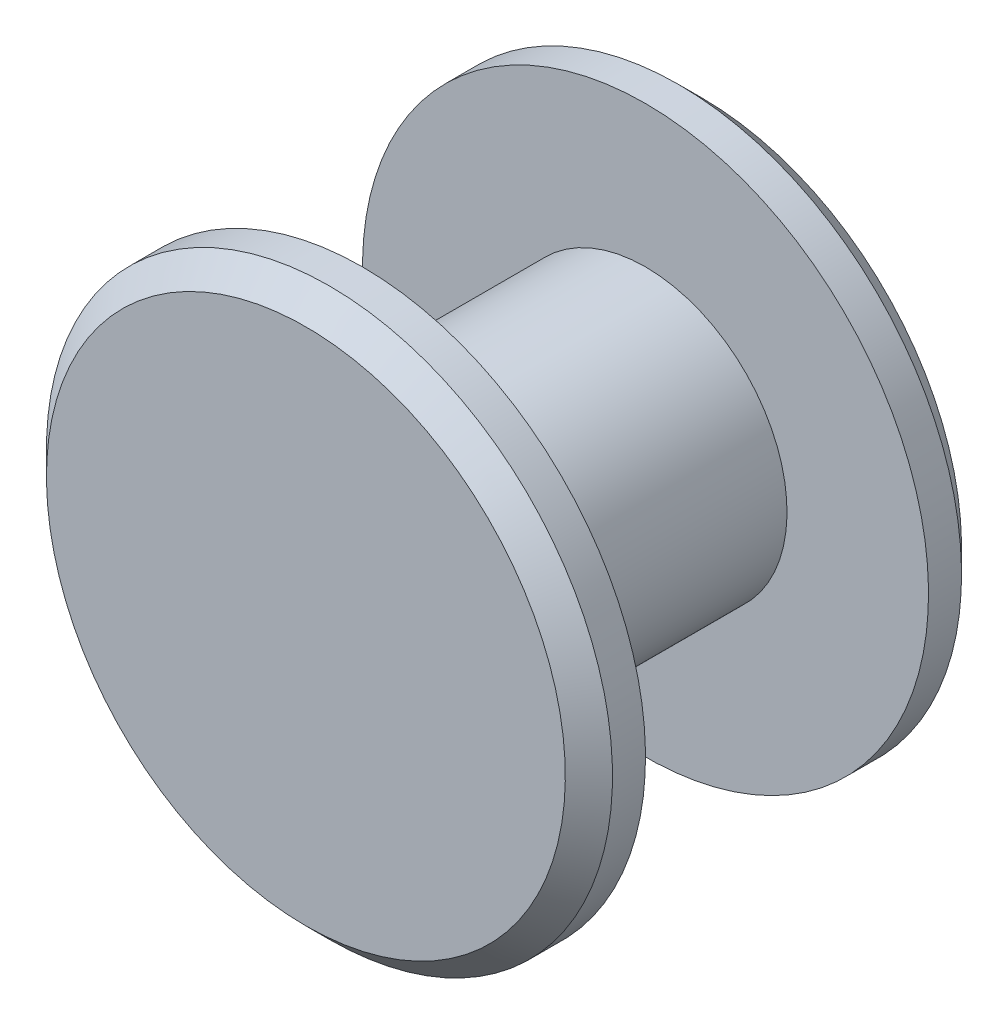
ISO-10303-21;
HEADER;
FILE_DESCRIPTION(('STEP AP214'),'2;1');
FILE_NAME('part.step','',(''),(''),'','','');
FILE_SCHEMA(('AUTOMOTIVE_DESIGN { 1 0 10303 214 1 1 1 1 }'));
ENDSEC;
DATA;
#1=APPLICATION_CONTEXT('core data for automotive mechanical design processes');
#2=APPLICATION_PROTOCOL_DEFINITION('international standard','automotive_design',2000,#1);
#3=PRODUCT_CONTEXT('',#1,'mechanical');
#4=PRODUCT('Part','Part','',(#3));
#5=PRODUCT_RELATED_PRODUCT_CATEGORY('part','',(#4));
#6=PRODUCT_DEFINITION_FORMATION('','',#4);
#7=PRODUCT_DEFINITION_CONTEXT('part definition',#1,'design');
#8=PRODUCT_DEFINITION('design','',#6,#7);
#9=PRODUCT_DEFINITION_SHAPE('','',#8);
#10=(LENGTH_UNIT() NAMED_UNIT(*) SI_UNIT(.MILLI.,.METRE.));
#11=(NAMED_UNIT(*) PLANE_ANGLE_UNIT() SI_UNIT($,.RADIAN.));
#12=(NAMED_UNIT(*) SI_UNIT($,.STERADIAN.) SOLID_ANGLE_UNIT());
#13=UNCERTAINTY_MEASURE_WITH_UNIT(LENGTH_MEASURE(1.E-05),#10,'distance_accuracy_value','');
#14=(GEOMETRIC_REPRESENTATION_CONTEXT(3) GLOBAL_UNCERTAINTY_ASSIGNED_CONTEXT((#13)) GLOBAL_UNIT_ASSIGNED_CONTEXT((#10,
#11,#12)) REPRESENTATION_CONTEXT('',''));
#15=CARTESIAN_POINT('',(0.,0.,0.));
#16=DIRECTION('',(0.,0.,1.));
#17=DIRECTION('',(1.,0.,0.));
#18=AXIS2_PLACEMENT_3D('',#15,#16,#17);
#19=CARTESIAN_POINT('',(0.,0.,0.));
#20=DIRECTION('',(0.,0.,1.));
#21=DIRECTION('',(0.,-1.,0.));
#22=AXIS2_PLACEMENT_3D('',#19,#20,#21);
#23=PLANE('',#22);
#24=CARTESIAN_POINT('',(0.,0.,0.));
#25=DIRECTION('',(0.,0.,1.));
#26=DIRECTION('',(0.,-1.,0.));
#27=AXIS2_PLACEMENT_3D('',#24,#25,#26);
#28=CIRCLE('',#27,2.75);
#29=CARTESIAN_POINT('',(0.,-2.75,0.));
#30=VERTEX_POINT('',#29);
#31=EDGE_CURVE('E10',#30,#30,#28,.T.);
#32=ORIENTED_EDGE('',*,*,#31,.T.);
#33=EDGE_LOOP('',(#32));
#34=FACE_BOUND('',#33,.T.);
#35=ADVANCED_FACE('F46',(#34),#23,.T.);
#36=CARTESIAN_POINT('',(0.,0.,0.));
#37=DIRECTION('',(0.,0.,-1.));
#38=DIRECTION('',(0.,1.,0.));
#39=AXIS2_PLACEMENT_3D('',#36,#37,#38);
#40=CYLINDRICAL_SURFACE('',#39,3.);
#41=CARTESIAN_POINT('',(0.,0.,-0.249999999999999));
#42=DIRECTION('',(0.,0.,1.));
#43=DIRECTION('',(0.,-1.,0.));
#44=AXIS2_PLACEMENT_3D('',#41,#42,#43);
#45=CIRCLE('',#44,3.);
#46=CARTESIAN_POINT('',(0.,-3.,-0.25));
#47=VERTEX_POINT('',#46);
#48=EDGE_CURVE('E55',#47,#47,#45,.F.);
#49=ORIENTED_EDGE('',*,*,#48,.T.);
#50=EDGE_LOOP('',(#49));
#51=FACE_BOUND('',#50,.T.);
#52=CARTESIAN_POINT('',(0.,0.,-0.6));
#53=DIRECTION('',(0.,0.,-1.));
#54=DIRECTION('',(0.,1.,0.));
#55=AXIS2_PLACEMENT_3D('',#52,#53,#54);
#56=CIRCLE('',#55,3.);
#57=CARTESIAN_POINT('',(0.,3.,-0.6));
#58=VERTEX_POINT('',#57);
#59=EDGE_CURVE('E73',#58,#58,#56,.T.);
#60=ORIENTED_EDGE('',*,*,#59,.F.);
#61=EDGE_LOOP('',(#60));
#62=FACE_BOUND('',#61,.T.);
#63=ADVANCED_FACE('F109',(#51,#62),#40,.T.);
#64=CARTESIAN_POINT('',(0.,3.,-0.6));
#65=DIRECTION('',(0.,0.,-1.));
#66=DIRECTION('',(0.,1.,0.));
#67=AXIS2_PLACEMENT_3D('',#64,#65,#66);
#68=PLANE('',#67);
#69=ORIENTED_EDGE('',*,*,#59,.T.);
#70=EDGE_LOOP('',(#69));
#71=FACE_BOUND('',#70,.T.);
#72=CARTESIAN_POINT('',(0.,0.,-0.6));
#73=DIRECTION('',(0.,0.,-1.));
#74=DIRECTION('',(0.,1.,0.));
#75=AXIS2_PLACEMENT_3D('',#72,#73,#74);
#76=CIRCLE('',#75,1.5);
#77=CARTESIAN_POINT('',(0.,1.5,-0.6));
#78=VERTEX_POINT('',#77);
#79=EDGE_CURVE('E77',#78,#78,#76,.T.);
#80=ORIENTED_EDGE('',*,*,#79,.F.);
#81=EDGE_LOOP('',(#80));
#82=FACE_BOUND('',#81,.T.);
#83=ADVANCED_FACE('F105',(#71,#82),#68,.T.);
#84=CARTESIAN_POINT('',(0.,0.,0.));
#85=DIRECTION('',(0.,0.,-1.));
#86=DIRECTION('',(0.,1.,0.));
#87=AXIS2_PLACEMENT_3D('',#84,#85,#86);
#88=CYLINDRICAL_SURFACE('',#87,1.5);
#89=ORIENTED_EDGE('',*,*,#79,.T.);
#90=EDGE_LOOP('',(#89));
#91=FACE_BOUND('',#90,.T.);
#92=CARTESIAN_POINT('',(0.,0.,-3.6));
#93=DIRECTION('',(0.,0.,-1.));
#94=DIRECTION('',(0.,1.,0.));
#95=AXIS2_PLACEMENT_3D('',#92,#93,#94);
#96=CIRCLE('',#95,1.5);
#97=CARTESIAN_POINT('',(0.,1.5,-3.6));
#98=VERTEX_POINT('',#97);
#99=EDGE_CURVE('E81',#98,#98,#96,.T.);
#100=ORIENTED_EDGE('',*,*,#99,.F.);
#101=EDGE_LOOP('',(#100));
#102=FACE_BOUND('',#101,.T.);
#103=ADVANCED_FACE('F95',(#91,#102),#88,.T.);
#104=CARTESIAN_POINT('',(0.,1.5,-3.6));
#105=DIRECTION('',(0.,0.,1.));
#106=DIRECTION('',(0.,-1.,0.));
#107=AXIS2_PLACEMENT_3D('',#104,#105,#106);
#108=PLANE('',#107);
#109=ORIENTED_EDGE('',*,*,#99,.T.);
#110=EDGE_LOOP('',(#109));
#111=FACE_BOUND('',#110,.T.);
#112=CARTESIAN_POINT('',(0.,0.,-3.6));
#113=DIRECTION('',(0.,0.,-1.));
#114=DIRECTION('',(0.,1.,0.));
#115=AXIS2_PLACEMENT_3D('',#112,#113,#114);
#116=CIRCLE('',#115,3.);
#117=CARTESIAN_POINT('',(0.,3.,-3.6));
#118=VERTEX_POINT('',#117);
#119=EDGE_CURVE('E85',#118,#118,#116,.T.);
#120=ORIENTED_EDGE('',*,*,#119,.F.);
#121=EDGE_LOOP('',(#120));
#122=FACE_BOUND('',#121,.T.);
#123=ADVANCED_FACE('F93',(#111,#122),#108,.T.);
#124=CARTESIAN_POINT('',(0.,0.,0.));
#125=DIRECTION('',(0.,0.,-1.));
#126=DIRECTION('',(0.,1.,0.));
#127=AXIS2_PLACEMENT_3D('',#124,#125,#126);
#128=CYLINDRICAL_SURFACE('',#127,3.);
#129=CARTESIAN_POINT('',(0.,0.,-3.95));
#130=DIRECTION('',(0.,0.,-1.));
#131=DIRECTION('',(0.,1.,0.));
#132=AXIS2_PLACEMENT_3D('',#129,#130,#131);
#133=CIRCLE('',#132,3.);
#134=CARTESIAN_POINT('',(0.,3.,-3.95));
#135=VERTEX_POINT('',#134);
#136=EDGE_CURVE('E61',#135,#135,#133,.F.);
#137=ORIENTED_EDGE('',*,*,#136,.T.);
#138=EDGE_LOOP('',(#137));
#139=FACE_BOUND('',#138,.T.);
#140=ORIENTED_EDGE('',*,*,#119,.T.);
#141=EDGE_LOOP('',(#140));
#142=FACE_BOUND('',#141,.T.);
#143=ADVANCED_FACE('F91',(#139,#142),#128,.T.);
#144=CARTESIAN_POINT('',(0.,3.,-4.2));
#145=DIRECTION('',(0.,0.,-1.));
#146=DIRECTION('',(0.,1.,0.));
#147=AXIS2_PLACEMENT_3D('',#144,#145,#146);
#148=PLANE('',#147);
#149=CARTESIAN_POINT('',(0.,0.,-4.2));
#150=DIRECTION('',(0.,0.,-1.));
#151=DIRECTION('',(0.,1.,0.));
#152=AXIS2_PLACEMENT_3D('',#149,#150,#151);
#153=CIRCLE('',#152,2.75);
#154=CARTESIAN_POINT('',(0.,2.75,-4.2));
#155=VERTEX_POINT('',#154);
#156=EDGE_CURVE('E67',#155,#155,#153,.T.);
#157=ORIENTED_EDGE('',*,*,#156,.T.);
#158=EDGE_LOOP('',(#157));
#159=FACE_BOUND('',#158,.T.);
#160=ADVANCED_FACE('F102',(#159),#148,.T.);
#161=CARTESIAN_POINT('',(0.,0.,-4.2));
#162=DIRECTION('',(0.,0.,1.));
#163=DIRECTION('',(0.,-1.,0.));
#164=AXIS2_PLACEMENT_3D('',#161,#162,#163);
#165=CONICAL_SURFACE('',#164,2.75,0.785398163397446);
#166=ORIENTED_EDGE('',*,*,#136,.F.);
#167=EDGE_LOOP('',(#166));
#168=FACE_BOUND('',#167,.T.);
#169=ORIENTED_EDGE('',*,*,#156,.F.);
#170=EDGE_LOOP('',(#169));
#171=FACE_BOUND('',#170,.T.);
#172=ADVANCED_FACE('F117',(#168,#171),#165,.T.);
#173=CARTESIAN_POINT('',(0.,0.,-0.249999999999999));
#174=DIRECTION('',(0.,0.,-1.));
#175=DIRECTION('',(0.,1.,0.));
#176=AXIS2_PLACEMENT_3D('',#173,#174,#175);
#177=CONICAL_SURFACE('',#176,3.,0.785398163397451);
#178=ORIENTED_EDGE('',*,*,#31,.F.);
#179=EDGE_LOOP('',(#178));
#180=FACE_BOUND('',#179,.T.);
#181=ORIENTED_EDGE('',*,*,#48,.F.);
#182=EDGE_LOOP('',(#181));
#183=FACE_BOUND('',#182,.T.);
#184=ADVANCED_FACE('F49',(#180,#183),#177,.T.);
#185=CLOSED_SHELL('',(#35,#63,#83,#103,#123,#143,#160,#172,#184));
#186=MANIFOLD_SOLID_BREP('B2',#185);
#187=ADVANCED_BREP_SHAPE_REPRESENTATION('',(#18,#186),#14);
#188=SHAPE_DEFINITION_REPRESENTATION(#9,#187);
ENDSEC;
END-ISO-10303-21;
